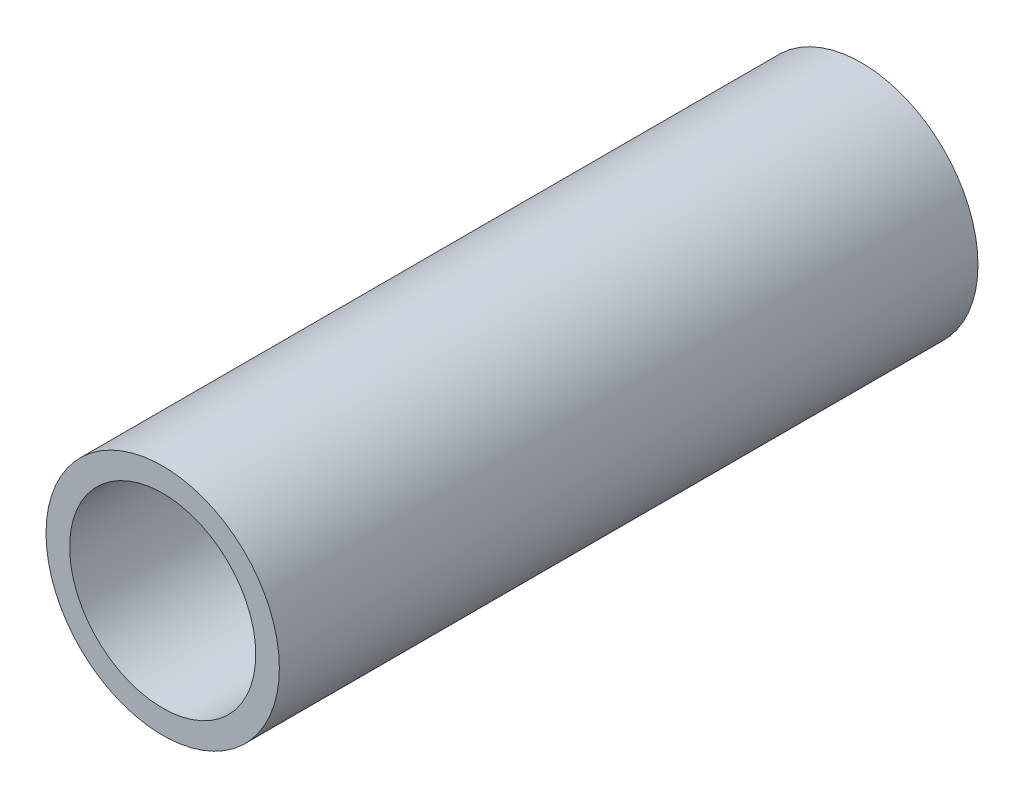
ISO-10303-21;
HEADER;
FILE_DESCRIPTION(('STEP AP214'),'2;1');
FILE_NAME('part.step','',(''),(''),'','','');
FILE_SCHEMA(('AUTOMOTIVE_DESIGN { 1 0 10303 214 1 1 1 1 }'));
ENDSEC;
DATA;
#1=APPLICATION_CONTEXT('core data for automotive mechanical design processes');
#2=APPLICATION_PROTOCOL_DEFINITION('international standard','automotive_design',2000,#1);
#3=PRODUCT_CONTEXT('',#1,'mechanical');
#4=PRODUCT('Part','Part','',(#3));
#5=PRODUCT_RELATED_PRODUCT_CATEGORY('part','',(#4));
#6=PRODUCT_DEFINITION_FORMATION('','',#4);
#7=PRODUCT_DEFINITION_CONTEXT('part definition',#1,'design');
#8=PRODUCT_DEFINITION('design','',#6,#7);
#9=PRODUCT_DEFINITION_SHAPE('','',#8);
#10=(LENGTH_UNIT() NAMED_UNIT(*) SI_UNIT(.MILLI.,.METRE.));
#11=(NAMED_UNIT(*) PLANE_ANGLE_UNIT() SI_UNIT($,.RADIAN.));
#12=(NAMED_UNIT(*) SI_UNIT($,.STERADIAN.) SOLID_ANGLE_UNIT());
#13=UNCERTAINTY_MEASURE_WITH_UNIT(LENGTH_MEASURE(1.E-05),#10,'distance_accuracy_value','');
#14=(GEOMETRIC_REPRESENTATION_CONTEXT(3) GLOBAL_UNCERTAINTY_ASSIGNED_CONTEXT((#13)) GLOBAL_UNIT_ASSIGNED_CONTEXT((#10,
#11,#12)) REPRESENTATION_CONTEXT('',''));
#15=CARTESIAN_POINT('',(0.,0.,0.));
#16=DIRECTION('',(0.,0.,1.));
#17=DIRECTION('',(1.,0.,0.));
#18=AXIS2_PLACEMENT_3D('',#15,#16,#17);
#19=CARTESIAN_POINT('',(0.,0.,50.));
#20=DIRECTION('',(0.,0.,1.));
#21=DIRECTION('',(1.,0.,0.));
#22=AXIS2_PLACEMENT_3D('',#19,#20,#21);
#23=PLANE('',#22);
#24=CARTESIAN_POINT('',(0.,0.,50.));
#25=DIRECTION('',(0.,0.,1.));
#26=DIRECTION('',(1.,0.,0.));
#27=AXIS2_PLACEMENT_3D('',#24,#25,#26);
#28=CIRCLE('',#27,16.7005);
#29=CARTESIAN_POINT('',(16.7005,0.,50.));
#30=VERTEX_POINT('',#29);
#31=EDGE_CURVE('E11',#30,#30,#28,.T.);
#32=ORIENTED_EDGE('',*,*,#31,.T.);
#33=EDGE_LOOP('',(#32));
#34=FACE_BOUND('',#33,.T.);
#35=CARTESIAN_POINT('',(0.,0.,50.));
#36=DIRECTION('',(0.,0.,1.));
#37=DIRECTION('',(1.,0.,0.));
#38=AXIS2_PLACEMENT_3D('',#35,#36,#37);
#39=CIRCLE('',#38,13.3223);
#40=CARTESIAN_POINT('',(13.3223,0.,50.));
#41=VERTEX_POINT('',#40);
#42=EDGE_CURVE('E49',#41,#41,#39,.T.);
#43=ORIENTED_EDGE('',*,*,#42,.F.);
#44=EDGE_LOOP('',(#43));
#45=FACE_BOUND('',#44,.T.);
#46=ADVANCED_FACE('F38',(#34,#45),#23,.T.);
#47=CARTESIAN_POINT('',(0.,0.,-50.));
#48=DIRECTION('',(0.,0.,1.));
#49=DIRECTION('',(1.,0.,0.));
#50=AXIS2_PLACEMENT_3D('',#47,#48,#49);
#51=PLANE('',#50);
#52=CARTESIAN_POINT('',(0.,0.,-50.));
#53=DIRECTION('',(0.,0.,1.));
#54=DIRECTION('',(1.,0.,0.));
#55=AXIS2_PLACEMENT_3D('',#52,#53,#54);
#56=CIRCLE('',#55,16.7005);
#57=CARTESIAN_POINT('',(16.7005,0.,-50.));
#58=VERTEX_POINT('',#57);
#59=EDGE_CURVE('E42',#58,#58,#56,.T.);
#60=ORIENTED_EDGE('',*,*,#59,.F.);
#61=EDGE_LOOP('',(#60));
#62=FACE_BOUND('',#61,.T.);
#63=CARTESIAN_POINT('',(0.,0.,-50.));
#64=DIRECTION('',(0.,0.,1.));
#65=DIRECTION('',(1.,0.,0.));
#66=AXIS2_PLACEMENT_3D('',#63,#64,#65);
#67=CIRCLE('',#66,13.3223);
#68=CARTESIAN_POINT('',(13.3223,0.,-50.));
#69=VERTEX_POINT('',#68);
#70=EDGE_CURVE('E51',#69,#69,#67,.T.);
#71=ORIENTED_EDGE('',*,*,#70,.T.);
#72=EDGE_LOOP('',(#71));
#73=FACE_BOUND('',#72,.T.);
#74=ADVANCED_FACE('F61',(#62,#73),#51,.F.);
#75=CARTESIAN_POINT('',(0.,0.,50.));
#76=DIRECTION('',(0.,0.,-1.));
#77=DIRECTION('',(-1.,0.,0.));
#78=AXIS2_PLACEMENT_3D('',#75,#76,#77);
#79=CYLINDRICAL_SURFACE('',#78,16.7005);
#80=ORIENTED_EDGE('',*,*,#31,.F.);
#81=EDGE_LOOP('',(#80));
#82=FACE_BOUND('',#81,.T.);
#83=ORIENTED_EDGE('',*,*,#59,.T.);
#84=EDGE_LOOP('',(#83));
#85=FACE_BOUND('',#84,.T.);
#86=ADVANCED_FACE('F40',(#82,#85),#79,.T.);
#87=CARTESIAN_POINT('',(0.,0.,50.));
#88=DIRECTION('',(0.,0.,-1.));
#89=DIRECTION('',(-1.,0.,0.));
#90=AXIS2_PLACEMENT_3D('',#87,#88,#89);
#91=CYLINDRICAL_SURFACE('',#90,13.3223);
#92=ORIENTED_EDGE('',*,*,#42,.T.);
#93=EDGE_LOOP('',(#92));
#94=FACE_BOUND('',#93,.T.);
#95=ORIENTED_EDGE('',*,*,#70,.F.);
#96=EDGE_LOOP('',(#95));
#97=FACE_BOUND('',#96,.T.);
#98=ADVANCED_FACE('F57',(#94,#97),#91,.F.);
#99=CLOSED_SHELL('',(#46,#74,#86,#98));
#100=MANIFOLD_SOLID_BREP('B2',#99);
#101=ADVANCED_BREP_SHAPE_REPRESENTATION('',(#18,#100),#14);
#102=SHAPE_DEFINITION_REPRESENTATION(#9,#101);
ENDSEC;
END-ISO-10303-21;
